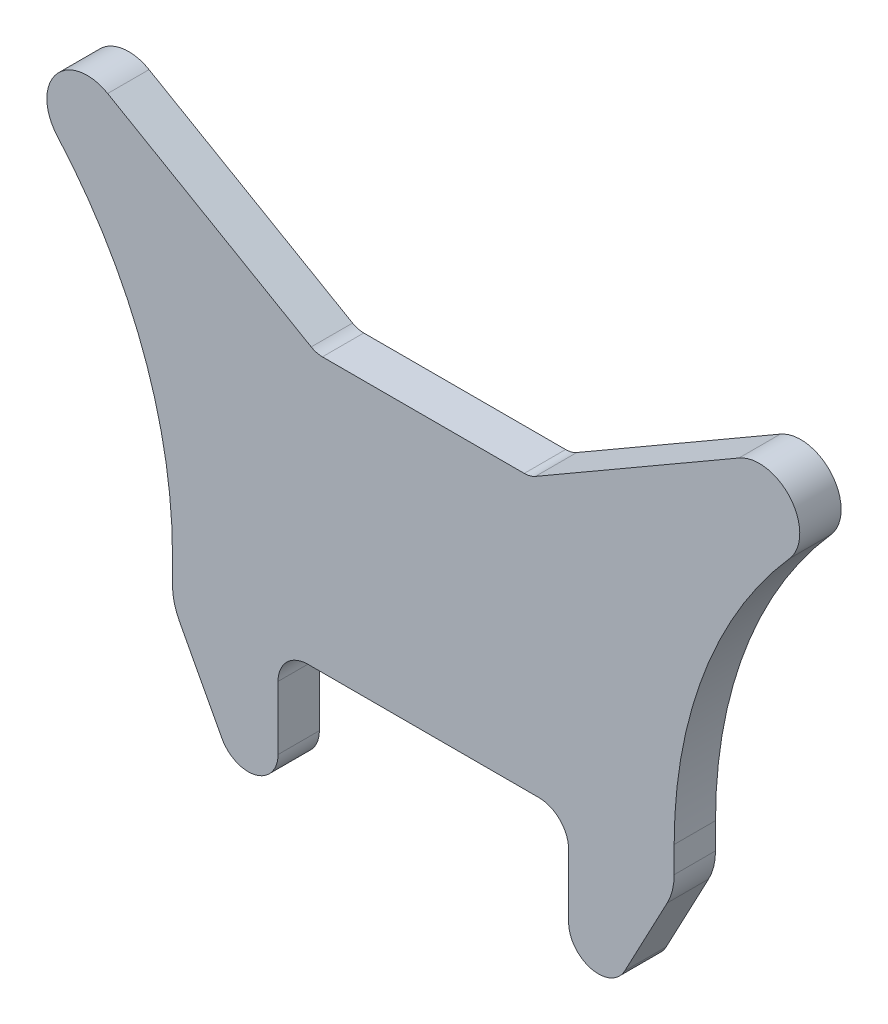
ISO-10303-21;
HEADER;
FILE_DESCRIPTION(('STEP AP214'),'2;1');
FILE_NAME('part.step','',(''),(''),'','','');
FILE_SCHEMA(('AUTOMOTIVE_DESIGN { 1 0 10303 214 1 1 1 1 }'));
ENDSEC;
DATA;
#1=APPLICATION_CONTEXT('core data for automotive mechanical design processes');
#2=APPLICATION_PROTOCOL_DEFINITION('international standard','automotive_design',2000,#1);
#3=PRODUCT_CONTEXT('',#1,'mechanical');
#4=PRODUCT('Part','Part','',(#3));
#5=PRODUCT_RELATED_PRODUCT_CATEGORY('part','',(#4));
#6=PRODUCT_DEFINITION_FORMATION('','',#4);
#7=PRODUCT_DEFINITION_CONTEXT('part definition',#1,'design');
#8=PRODUCT_DEFINITION('design','',#6,#7);
#9=PRODUCT_DEFINITION_SHAPE('','',#8);
#10=(LENGTH_UNIT() NAMED_UNIT(*) SI_UNIT(.MILLI.,.METRE.));
#11=(NAMED_UNIT(*) PLANE_ANGLE_UNIT() SI_UNIT($,.RADIAN.));
#12=(NAMED_UNIT(*) SI_UNIT($,.STERADIAN.) SOLID_ANGLE_UNIT());
#13=UNCERTAINTY_MEASURE_WITH_UNIT(LENGTH_MEASURE(1.E-05),#10,'distance_accuracy_value','');
#14=(GEOMETRIC_REPRESENTATION_CONTEXT(3) GLOBAL_UNCERTAINTY_ASSIGNED_CONTEXT((#13)) GLOBAL_UNIT_ASSIGNED_CONTEXT((#10,
#11,#12)) REPRESENTATION_CONTEXT('',''));
#15=CARTESIAN_POINT('',(0.,0.,0.));
#16=DIRECTION('',(0.,0.,1.));
#17=DIRECTION('',(1.,0.,0.));
#18=AXIS2_PLACEMENT_3D('',#15,#16,#17);
#19=CARTESIAN_POINT('',(23.5,-40.6195652173992,5.55));
#20=DIRECTION('',(0.,0.,-1.));
#21=DIRECTION('',(-1.,0.,0.));
#22=AXIS2_PLACEMENT_3D('',#19,#20,#21);
#23=CYLINDRICAL_SURFACE('',#22,4.);
#24=CARTESIAN_POINT('',(23.5,-40.6195652173992,0.));
#25=DIRECTION('',(0.,0.,1.));
#26=DIRECTION('',(1.,0.,0.));
#27=AXIS2_PLACEMENT_3D('',#24,#25,#26);
#28=CIRCLE('',#27,4.);
#29=CARTESIAN_POINT('',(19.5,-40.6195652173992,0.));
#30=VERTEX_POINT('',#29);
#31=CARTESIAN_POINT('',(27.0335689045937,-42.4941027060851,0.));
#32=VERTEX_POINT('',#31);
#33=EDGE_CURVE('E212',#30,#32,#28,.T.);
#34=ORIENTED_EDGE('',*,*,#33,.T.);
#35=DIRECTION('',(0.,0.,-1.));
#36=VECTOR('',#35,1.);
#37=CARTESIAN_POINT('',(27.0335689045937,-42.4941027060851,5.55));
#38=LINE('',#37,#36);
#39=CARTESIAN_POINT('',(27.0335689045937,-42.4941027060851,5.55));
#40=VERTEX_POINT('',#39);
#41=EDGE_CURVE('E11',#40,#32,#38,.T.);
#42=ORIENTED_EDGE('',*,*,#41,.F.);
#43=CARTESIAN_POINT('',(23.5,-40.6195652173992,5.55));
#44=DIRECTION('',(0.,0.,1.));
#45=DIRECTION('',(1.,0.,0.));
#46=AXIS2_PLACEMENT_3D('',#43,#44,#45);
#47=CIRCLE('',#46,4.);
#48=CARTESIAN_POINT('',(19.5,-40.6195652173992,5.55));
#49=VERTEX_POINT('',#48);
#50=EDGE_CURVE('E254',#49,#40,#47,.T.);
#51=ORIENTED_EDGE('',*,*,#50,.F.);
#52=DIRECTION('',(0.,0.,-1.));
#53=VECTOR('',#52,1.);
#54=CARTESIAN_POINT('',(19.5,-40.6195652173992,5.55));
#55=LINE('',#54,#53);
#56=EDGE_CURVE('E208',#49,#30,#55,.T.);
#57=ORIENTED_EDGE('',*,*,#56,.T.);
#58=EDGE_LOOP('',(#34,#42,#51,#57));
#59=FACE_BOUND('',#58,.T.);
#60=ADVANCED_FACE('F32',(#59),#23,.T.);
#61=CARTESIAN_POINT('',(27.0335689045937,-42.4941027060851,5.55));
#62=DIRECTION('',(-0.88339222614841,0.46863437217148,0.));
#63=DIRECTION('',(-0.46863437217148,-0.88339222614841,0.));
#64=AXIS2_PLACEMENT_3D('',#61,#62,#63);
#65=PLANE('',#64);
#66=DIRECTION('',(0.46863437217148,0.88339222614841,0.));
#67=VECTOR('',#66,1.);
#68=CARTESIAN_POINT('',(27.0335689045937,-42.4941027060851,0.));
#69=LINE('',#68,#67);
#70=CARTESIAN_POINT('',(32.7318830800073,-31.7525806504434,0.));
#71=VERTEX_POINT('',#70);
#72=EDGE_CURVE('E215',#32,#71,#69,.T.);
#73=ORIENTED_EDGE('',*,*,#72,.T.);
#74=DIRECTION('',(0.,0.,-1.));
#75=VECTOR('',#74,1.);
#76=CARTESIAN_POINT('',(32.7318830800073,-31.7525806504434,5.55));
#77=LINE('',#76,#75);
#78=CARTESIAN_POINT('',(32.7318830800073,-31.7525806504434,5.55));
#79=VERTEX_POINT('',#78);
#80=EDGE_CURVE('E40',#79,#71,#77,.T.);
#81=ORIENTED_EDGE('',*,*,#80,.F.);
#82=DIRECTION('',(0.46863437217148,0.88339222614841,0.));
#83=VECTOR('',#82,1.);
#84=CARTESIAN_POINT('',(27.0335689045937,-42.4941027060851,5.55));
#85=LINE('',#84,#83);
#86=EDGE_CURVE('E133',#40,#79,#85,.T.);
#87=ORIENTED_EDGE('',*,*,#86,.F.);
#88=ORIENTED_EDGE('',*,*,#41,.T.);
#89=EDGE_LOOP('',(#73,#81,#87,#88));
#90=FACE_BOUND('',#89,.T.);
#91=ADVANCED_FACE('F382',(#90),#65,.F.);
#92=CARTESIAN_POINT('',(25.6647452708201,-28.0035056730715,5.55));
#93=DIRECTION('',(0.,0.,-1.));
#94=DIRECTION('',(-1.,0.,0.));
#95=AXIS2_PLACEMENT_3D('',#92,#93,#94);
#96=CYLINDRICAL_SURFACE('',#95,8.);
#97=CARTESIAN_POINT('',(25.6647452708201,-28.0035056730715,0.));
#98=DIRECTION('',(0.,0.,1.));
#99=DIRECTION('',(-1.,0.,0.));
#100=AXIS2_PLACEMENT_3D('',#97,#98,#99);
#101=CIRCLE('',#100,8.);
#102=CARTESIAN_POINT('',(33.6647452708201,-28.0035056730715,0.));
#103=VERTEX_POINT('',#102);
#104=EDGE_CURVE('E217',#71,#103,#101,.T.);
#105=ORIENTED_EDGE('',*,*,#104,.T.);
#106=DIRECTION('',(0.,0.,-1.));
#107=VECTOR('',#106,1.);
#108=CARTESIAN_POINT('',(33.6647452708201,-28.0035056730715,5.55));
#109=LINE('',#108,#107);
#110=CARTESIAN_POINT('',(33.6647452708201,-28.0035056730715,5.55));
#111=VERTEX_POINT('',#110);
#112=EDGE_CURVE('E303',#111,#103,#109,.T.);
#113=ORIENTED_EDGE('',*,*,#112,.F.);
#114=CARTESIAN_POINT('',(25.6647452708201,-28.0035056730715,5.55));
#115=DIRECTION('',(0.,0.,1.));
#116=DIRECTION('',(-1.,0.,0.));
#117=AXIS2_PLACEMENT_3D('',#114,#115,#116);
#118=CIRCLE('',#117,8.);
#119=EDGE_CURVE('E311',#79,#111,#118,.T.);
#120=ORIENTED_EDGE('',*,*,#119,.F.);
#121=ORIENTED_EDGE('',*,*,#80,.T.);
#122=EDGE_LOOP('',(#105,#113,#120,#121));
#123=FACE_BOUND('',#122,.T.);
#124=ADVANCED_FACE('F309',(#123),#96,.T.);
#125=CARTESIAN_POINT('',(33.6647452708201,-28.0035056730715,5.55));
#126=DIRECTION('',(-1.,0.,0.));
#127=DIRECTION('',(0.,0.,1.));
#128=AXIS2_PLACEMENT_3D('',#125,#126,#127);
#129=PLANE('',#128);
#130=DIRECTION('',(0.,1.,0.));
#131=VECTOR('',#130,1.);
#132=CARTESIAN_POINT('',(33.6647452708201,-28.0035056730715,0.));
#133=LINE('',#132,#131);
#134=CARTESIAN_POINT('',(33.6647452708201,-24.4941027060851,0.));
#135=VERTEX_POINT('',#134);
#136=EDGE_CURVE('E219',#103,#135,#133,.T.);
#137=ORIENTED_EDGE('',*,*,#136,.T.);
#138=DIRECTION('',(0.,0.,-1.));
#139=VECTOR('',#138,1.);
#140=CARTESIAN_POINT('',(33.6647452708201,-24.4941027060851,5.55));
#141=LINE('',#140,#139);
#142=CARTESIAN_POINT('',(33.6647452708201,-24.4941027060851,5.55));
#143=VERTEX_POINT('',#142);
#144=EDGE_CURVE('E300',#143,#135,#141,.T.);
#145=ORIENTED_EDGE('',*,*,#144,.F.);
#146=DIRECTION('',(0.,1.,0.));
#147=VECTOR('',#146,1.);
#148=CARTESIAN_POINT('',(33.6647452708201,-28.0035056730715,5.55));
#149=LINE('',#148,#147);
#150=EDGE_CURVE('E329',#111,#143,#149,.T.);
#151=ORIENTED_EDGE('',*,*,#150,.F.);
#152=ORIENTED_EDGE('',*,*,#112,.T.);
#153=EDGE_LOOP('',(#137,#145,#151,#152));
#154=FACE_BOUND('',#153,.T.);
#155=ADVANCED_FACE('F320',(#154),#129,.F.);
#156=CARTESIAN_POINT('',(95.640551722433,-24.4941027060851,5.55));
#157=DIRECTION('',(0.,0.,-1.));
#158=DIRECTION('',(-1.,0.,0.));
#159=AXIS2_PLACEMENT_3D('',#156,#157,#158);
#160=CYLINDRICAL_SURFACE('',#159,61.9758064516129);
#161=CARTESIAN_POINT('',(95.640551722433,-24.4941027060851,0.));
#162=DIRECTION('',(0.,0.,-1.));
#163=DIRECTION('',(-1.,0.,0.));
#164=AXIS2_PLACEMENT_3D('',#161,#162,#163);
#165=CIRCLE('',#164,61.9758064516129);
#166=CARTESIAN_POINT('',(49.1647452708201,16.5058972939149,0.));
#167=VERTEX_POINT('',#166);
#168=EDGE_CURVE('E221',#135,#167,#165,.T.);
#169=ORIENTED_EDGE('',*,*,#168,.T.);
#170=DIRECTION('',(0.,0.,-1.));
#171=VECTOR('',#170,1.);
#172=CARTESIAN_POINT('',(49.1647452708201,16.5058972939149,5.55));
#173=LINE('',#172,#171);
#174=CARTESIAN_POINT('',(49.1647452708201,16.5058972939149,5.55));
#175=VERTEX_POINT('',#174);
#176=EDGE_CURVE('E297',#175,#167,#173,.T.);
#177=ORIENTED_EDGE('',*,*,#176,.F.);
#178=CARTESIAN_POINT('',(95.640551722433,-24.4941027060851,5.55));
#179=DIRECTION('',(0.,0.,-1.));
#180=DIRECTION('',(-1.,0.,0.));
#181=AXIS2_PLACEMENT_3D('',#178,#179,#180);
#182=CIRCLE('',#181,61.9758064516129);
#183=EDGE_CURVE('E326',#143,#175,#182,.T.);
#184=ORIENTED_EDGE('',*,*,#183,.F.);
#185=ORIENTED_EDGE('',*,*,#144,.T.);
#186=EDGE_LOOP('',(#169,#177,#184,#185));
#187=FACE_BOUND('',#186,.T.);
#188=ADVANCED_FACE('F324',(#187),#160,.F.);
#189=CARTESIAN_POINT('',(45.0965247112885,20.0947977493476,5.55));
#190=DIRECTION('',(0.,0.,-1.));
#191=DIRECTION('',(-1.,0.,0.));
#192=AXIS2_PLACEMENT_3D('',#189,#190,#191);
#193=CYLINDRICAL_SURFACE('',#192,5.425);
#194=CARTESIAN_POINT('',(45.0965247112885,20.0947977493476,0.));
#195=DIRECTION('',(0.,0.,1.));
#196=DIRECTION('',(1.,0.,0.));
#197=AXIS2_PLACEMENT_3D('',#194,#195,#196);
#198=CIRCLE('',#197,5.425);
#199=CARTESIAN_POINT('',(42.3624013430761,24.7804347826008,0.));
#200=VERTEX_POINT('',#199);
#201=EDGE_CURVE('E223',#167,#200,#198,.T.);
#202=ORIENTED_EDGE('',*,*,#201,.T.);
#203=DIRECTION('',(0.,0.,-1.));
#204=VECTOR('',#203,1.);
#205=CARTESIAN_POINT('',(42.3624013430761,24.7804347826008,5.55));
#206=LINE('',#205,#204);
#207=CARTESIAN_POINT('',(42.3624013430761,24.7804347826008,5.55));
#208=VERTEX_POINT('',#207);
#209=EDGE_CURVE('E294',#208,#200,#206,.T.);
#210=ORIENTED_EDGE('',*,*,#209,.F.);
#211=CARTESIAN_POINT('',(45.0965247112885,20.0947977493476,5.55));
#212=DIRECTION('',(0.,0.,1.));
#213=DIRECTION('',(1.,0.,0.));
#214=AXIS2_PLACEMENT_3D('',#211,#212,#213);
#215=CIRCLE('',#214,5.425);
#216=EDGE_CURVE('E328',#175,#208,#215,.T.);
#217=ORIENTED_EDGE('',*,*,#216,.F.);
#218=ORIENTED_EDGE('',*,*,#176,.T.);
#219=EDGE_LOOP('',(#202,#210,#217,#218));
#220=FACE_BOUND('',#219,.T.);
#221=ADVANCED_FACE('F395',(#220),#193,.T.);
#222=CARTESIAN_POINT('',(42.3624013430761,24.7804347826008,5.55));
#223=DIRECTION('',(0.5006264064338,-0.865663445676886,0.));
#224=DIRECTION('',(0.865663445676886,0.5006264064338,0.));
#225=AXIS2_PLACEMENT_3D('',#222,#223,#224);
#226=PLANE('',#225);
#227=DIRECTION('',(-0.865663445676886,-0.5006264064338,0.));
#228=VECTOR('',#227,1.);
#229=CARTESIAN_POINT('',(42.3624013430761,24.7804347826008,0.));
#230=LINE('',#229,#228);
#231=CARTESIAN_POINT('',(15.0468684212491,8.9834444455702,0.));
#232=VERTEX_POINT('',#231);
#233=EDGE_CURVE('E225',#200,#232,#230,.T.);
#234=ORIENTED_EDGE('',*,*,#233,.T.);
#235=DIRECTION('',(0.,0.,-1.));
#236=VECTOR('',#235,1.);
#237=CARTESIAN_POINT('',(15.0468684212491,8.9834444455702,5.55));
#238=LINE('',#237,#236);
#239=CARTESIAN_POINT('',(15.0468684212491,8.9834444455702,5.55));
#240=VERTEX_POINT('',#239);
#241=EDGE_CURVE('E291',#240,#232,#238,.T.);
#242=ORIENTED_EDGE('',*,*,#241,.F.);
#243=DIRECTION('',(-0.865663445676886,-0.5006264064338,0.));
#244=VECTOR('',#243,1.);
#245=CARTESIAN_POINT('',(42.3624013430761,24.7804347826008,5.55));
#246=LINE('',#245,#244);
#247=EDGE_CURVE('E331',#208,#240,#246,.T.);
#248=ORIENTED_EDGE('',*,*,#247,.F.);
#249=ORIENTED_EDGE('',*,*,#209,.T.);
#250=EDGE_LOOP('',(#234,#242,#248,#249));
#251=FACE_BOUND('',#250,.T.);
#252=ADVANCED_FACE('F398',(#251),#226,.F.);
#253=CARTESIAN_POINT('',(13.5449892019477,11.5804347826008,5.55));
#254=DIRECTION('',(0.,0.,-1.));
#255=DIRECTION('',(-1.,0.,0.));
#256=AXIS2_PLACEMENT_3D('',#253,#254,#255);
#257=CYLINDRICAL_SURFACE('',#256,2.99999999999998);
#258=CARTESIAN_POINT('',(13.5449892019477,11.5804347826008,0.));
#259=DIRECTION('',(0.,0.,-1.));
#260=DIRECTION('',(-1.,0.,0.));
#261=AXIS2_PLACEMENT_3D('',#258,#259,#260);
#262=CIRCLE('',#261,2.99999999999998);
#263=CARTESIAN_POINT('',(13.5449892019477,8.58043478260083,0.));
#264=VERTEX_POINT('',#263);
#265=EDGE_CURVE('E227',#232,#264,#262,.T.);
#266=ORIENTED_EDGE('',*,*,#265,.T.);
#267=DIRECTION('',(0.,0.,-1.));
#268=VECTOR('',#267,1.);
#269=CARTESIAN_POINT('',(13.5449892019477,8.58043478260083,5.55));
#270=LINE('',#269,#268);
#271=CARTESIAN_POINT('',(13.5449892019477,8.58043478260083,5.55));
#272=VERTEX_POINT('',#271);
#273=EDGE_CURVE('E288',#272,#264,#270,.T.);
#274=ORIENTED_EDGE('',*,*,#273,.F.);
#275=CARTESIAN_POINT('',(13.5449892019477,11.5804347826008,5.55));
#276=DIRECTION('',(0.,0.,-1.));
#277=DIRECTION('',(-1.,0.,0.));
#278=AXIS2_PLACEMENT_3D('',#275,#276,#277);
#279=CIRCLE('',#278,2.99999999999998);
#280=EDGE_CURVE('E337',#240,#272,#279,.T.);
#281=ORIENTED_EDGE('',*,*,#280,.F.);
#282=ORIENTED_EDGE('',*,*,#241,.T.);
#283=EDGE_LOOP('',(#266,#274,#281,#282));
#284=FACE_BOUND('',#283,.T.);
#285=ADVANCED_FACE('F402',(#284),#257,.F.);
#286=CARTESIAN_POINT('',(13.5449892019477,8.58043478260083,5.55));
#287=DIRECTION('',(0.,-1.,0.));
#288=DIRECTION('',(1.,0.,0.));
#289=AXIS2_PLACEMENT_3D('',#286,#287,#288);
#290=PLANE('',#289);
#291=DIRECTION('',(-1.,0.,0.));
#292=VECTOR('',#291,1.);
#293=CARTESIAN_POINT('',(13.5449892019477,8.58043478260083,0.));
#294=LINE('',#293,#292);
#295=CARTESIAN_POINT('',(-13.5449892019477,8.58043478260085,0.));
#296=VERTEX_POINT('',#295);
#297=EDGE_CURVE('E229',#264,#296,#294,.T.);
#298=ORIENTED_EDGE('',*,*,#297,.T.);
#299=DIRECTION('',(0.,0.,-1.));
#300=VECTOR('',#299,1.);
#301=CARTESIAN_POINT('',(-13.5449892019477,8.58043478260085,5.55));
#302=LINE('',#301,#300);
#303=CARTESIAN_POINT('',(-13.5449892019477,8.58043478260085,5.55));
#304=VERTEX_POINT('',#303);
#305=EDGE_CURVE('E285',#304,#296,#302,.T.);
#306=ORIENTED_EDGE('',*,*,#305,.F.);
#307=DIRECTION('',(-1.,0.,0.));
#308=VECTOR('',#307,1.);
#309=CARTESIAN_POINT('',(13.5449892019477,8.58043478260083,5.55));
#310=LINE('',#309,#308);
#311=EDGE_CURVE('E339',#272,#304,#310,.T.);
#312=ORIENTED_EDGE('',*,*,#311,.F.);
#313=ORIENTED_EDGE('',*,*,#273,.T.);
#314=EDGE_LOOP('',(#298,#306,#312,#313));
#315=FACE_BOUND('',#314,.T.);
#316=ADVANCED_FACE('F406',(#315),#290,.F.);
#317=CARTESIAN_POINT('',(-13.5449892019477,11.5804347826009,5.55));
#318=DIRECTION('',(0.,0.,-1.));
#319=DIRECTION('',(-1.,0.,0.));
#320=AXIS2_PLACEMENT_3D('',#317,#318,#319);
#321=CYLINDRICAL_SURFACE('',#320,3.);
#322=CARTESIAN_POINT('',(-13.5449892019477,11.5804347826009,0.));
#323=DIRECTION('',(0.,0.,-1.));
#324=DIRECTION('',(1.,0.,0.));
#325=AXIS2_PLACEMENT_3D('',#322,#323,#324);
#326=CIRCLE('',#325,3.);
#327=CARTESIAN_POINT('',(-15.0468684212491,8.9834444455702,0.));
#328=VERTEX_POINT('',#327);
#329=EDGE_CURVE('E231',#296,#328,#326,.T.);
#330=ORIENTED_EDGE('',*,*,#329,.T.);
#331=DIRECTION('',(0.,0.,-1.));
#332=VECTOR('',#331,1.);
#333=CARTESIAN_POINT('',(-15.0468684212491,8.9834444455702,5.55));
#334=LINE('',#333,#332);
#335=CARTESIAN_POINT('',(-15.0468684212491,8.9834444455702,5.55));
#336=VERTEX_POINT('',#335);
#337=EDGE_CURVE('E282',#336,#328,#334,.T.);
#338=ORIENTED_EDGE('',*,*,#337,.F.);
#339=CARTESIAN_POINT('',(-13.5449892019477,11.5804347826009,5.55));
#340=DIRECTION('',(0.,0.,-1.));
#341=DIRECTION('',(1.,0.,0.));
#342=AXIS2_PLACEMENT_3D('',#339,#340,#341);
#343=CIRCLE('',#342,3.);
#344=EDGE_CURVE('E341',#304,#336,#343,.T.);
#345=ORIENTED_EDGE('',*,*,#344,.F.);
#346=ORIENTED_EDGE('',*,*,#305,.T.);
#347=EDGE_LOOP('',(#330,#338,#345,#346));
#348=FACE_BOUND('',#347,.T.);
#349=ADVANCED_FACE('F410',(#348),#321,.F.);
#350=CARTESIAN_POINT('',(-42.3624013430761,24.7804347826008,5.55));
#351=DIRECTION('',(-0.500626406433801,-0.865663445676886,0.));
#352=DIRECTION('',(0.865663445676886,-0.500626406433801,0.));
#353=AXIS2_PLACEMENT_3D('',#350,#351,#352);
#354=PLANE('',#353);
#355=DIRECTION('',(-0.865663445676886,0.500626406433801,0.));
#356=VECTOR('',#355,1.);
#357=CARTESIAN_POINT('',(-42.3624013430761,24.7804347826008,0.));
#358=LINE('',#357,#356);
#359=CARTESIAN_POINT('',(-42.3624013430761,24.7804347826008,0.));
#360=VERTEX_POINT('',#359);
#361=EDGE_CURVE('E233',#328,#360,#358,.T.);
#362=ORIENTED_EDGE('',*,*,#361,.T.);
#363=DIRECTION('',(0.,0.,-1.));
#364=VECTOR('',#363,1.);
#365=CARTESIAN_POINT('',(-42.3624013430761,24.7804347826008,5.55));
#366=LINE('',#365,#364);
#367=CARTESIAN_POINT('',(-42.3624013430761,24.7804347826008,5.55));
#368=VERTEX_POINT('',#367);
#369=EDGE_CURVE('E279',#368,#360,#366,.T.);
#370=ORIENTED_EDGE('',*,*,#369,.F.);
#371=DIRECTION('',(-0.865663445676886,0.500626406433801,0.));
#372=VECTOR('',#371,1.);
#373=CARTESIAN_POINT('',(-42.3624013430761,24.7804347826008,5.55));
#374=LINE('',#373,#372);
#375=EDGE_CURVE('E343',#336,#368,#374,.T.);
#376=ORIENTED_EDGE('',*,*,#375,.F.);
#377=ORIENTED_EDGE('',*,*,#337,.T.);
#378=EDGE_LOOP('',(#362,#370,#376,#377));
#379=FACE_BOUND('',#378,.T.);
#380=ADVANCED_FACE('F414',(#379),#354,.F.);
#381=CARTESIAN_POINT('',(-45.0965247112885,20.0947977493476,5.55));
#382=DIRECTION('',(0.,0.,-1.));
#383=DIRECTION('',(-1.,0.,0.));
#384=AXIS2_PLACEMENT_3D('',#381,#382,#383);
#385=CYLINDRICAL_SURFACE('',#384,5.425);
#386=CARTESIAN_POINT('',(-45.0965247112885,20.0947977493476,0.));
#387=DIRECTION('',(0.,0.,1.));
#388=DIRECTION('',(-1.,0.,0.));
#389=AXIS2_PLACEMENT_3D('',#386,#387,#388);
#390=CIRCLE('',#389,5.425);
#391=CARTESIAN_POINT('',(-49.1647452708201,16.5058972939149,0.));
#392=VERTEX_POINT('',#391);
#393=EDGE_CURVE('E235',#360,#392,#390,.T.);
#394=ORIENTED_EDGE('',*,*,#393,.T.);
#395=DIRECTION('',(0.,0.,-1.));
#396=VECTOR('',#395,1.);
#397=CARTESIAN_POINT('',(-49.1647452708201,16.5058972939149,5.55));
#398=LINE('',#397,#396);
#399=CARTESIAN_POINT('',(-49.1647452708201,16.5058972939149,5.55));
#400=VERTEX_POINT('',#399);
#401=EDGE_CURVE('E276',#400,#392,#398,.T.);
#402=ORIENTED_EDGE('',*,*,#401,.F.);
#403=CARTESIAN_POINT('',(-45.0965247112885,20.0947977493476,5.55));
#404=DIRECTION('',(0.,0.,1.));
#405=DIRECTION('',(-1.,0.,0.));
#406=AXIS2_PLACEMENT_3D('',#403,#404,#405);
#407=CIRCLE('',#406,5.425);
#408=EDGE_CURVE('E345',#368,#400,#407,.T.);
#409=ORIENTED_EDGE('',*,*,#408,.F.);
#410=ORIENTED_EDGE('',*,*,#369,.T.);
#411=EDGE_LOOP('',(#394,#402,#409,#410));
#412=FACE_BOUND('',#411,.T.);
#413=ADVANCED_FACE('F418',(#412),#385,.T.);
#414=CARTESIAN_POINT('',(-95.640551722433,-24.494102706085,5.55));
#415=DIRECTION('',(0.,0.,-1.));
#416=DIRECTION('',(-1.,0.,0.));
#417=AXIS2_PLACEMENT_3D('',#414,#415,#416);
#418=CYLINDRICAL_SURFACE('',#417,61.9758064516129);
#419=CARTESIAN_POINT('',(-95.640551722433,-24.494102706085,0.));
#420=DIRECTION('',(0.,0.,-1.));
#421=DIRECTION('',(1.,0.,0.));
#422=AXIS2_PLACEMENT_3D('',#419,#420,#421);
#423=CIRCLE('',#422,61.9758064516129);
#424=CARTESIAN_POINT('',(-33.6647452708201,-24.494102706085,0.));
#425=VERTEX_POINT('',#424);
#426=EDGE_CURVE('E237',#392,#425,#423,.T.);
#427=ORIENTED_EDGE('',*,*,#426,.T.);
#428=DIRECTION('',(0.,0.,-1.));
#429=VECTOR('',#428,1.);
#430=CARTESIAN_POINT('',(-33.6647452708201,-24.494102706085,5.55));
#431=LINE('',#430,#429);
#432=CARTESIAN_POINT('',(-33.6647452708201,-24.494102706085,5.55));
#433=VERTEX_POINT('',#432);
#434=EDGE_CURVE('E273',#433,#425,#431,.T.);
#435=ORIENTED_EDGE('',*,*,#434,.F.);
#436=CARTESIAN_POINT('',(-95.640551722433,-24.494102706085,5.55));
#437=DIRECTION('',(0.,0.,-1.));
#438=DIRECTION('',(1.,0.,0.));
#439=AXIS2_PLACEMENT_3D('',#436,#437,#438);
#440=CIRCLE('',#439,61.9758064516129);
#441=EDGE_CURVE('E347',#400,#433,#440,.T.);
#442=ORIENTED_EDGE('',*,*,#441,.F.);
#443=ORIENTED_EDGE('',*,*,#401,.T.);
#444=EDGE_LOOP('',(#427,#435,#442,#443));
#445=FACE_BOUND('',#444,.T.);
#446=ADVANCED_FACE('F422',(#445),#418,.F.);
#447=CARTESIAN_POINT('',(-33.6647452708201,-28.0035056730715,5.55));
#448=DIRECTION('',(1.,0.,0.));
#449=DIRECTION('',(0.,0.,-1.));
#450=AXIS2_PLACEMENT_3D('',#447,#448,#449);
#451=PLANE('',#450);
#452=DIRECTION('',(0.,-1.,0.));
#453=VECTOR('',#452,1.);
#454=CARTESIAN_POINT('',(-33.6647452708201,-28.0035056730715,0.));
#455=LINE('',#454,#453);
#456=CARTESIAN_POINT('',(-33.6647452708201,-28.0035056730715,0.));
#457=VERTEX_POINT('',#456);
#458=EDGE_CURVE('E239',#425,#457,#455,.T.);
#459=ORIENTED_EDGE('',*,*,#458,.T.);
#460=DIRECTION('',(0.,0.,-1.));
#461=VECTOR('',#460,1.);
#462=CARTESIAN_POINT('',(-33.6647452708201,-28.0035056730715,5.55));
#463=LINE('',#462,#461);
#464=CARTESIAN_POINT('',(-33.6647452708201,-28.0035056730715,5.55));
#465=VERTEX_POINT('',#464);
#466=EDGE_CURVE('E270',#465,#457,#463,.T.);
#467=ORIENTED_EDGE('',*,*,#466,.F.);
#468=DIRECTION('',(0.,-1.,0.));
#469=VECTOR('',#468,1.);
#470=CARTESIAN_POINT('',(-33.6647452708201,-28.0035056730715,5.55));
#471=LINE('',#470,#469);
#472=EDGE_CURVE('E349',#433,#465,#471,.T.);
#473=ORIENTED_EDGE('',*,*,#472,.F.);
#474=ORIENTED_EDGE('',*,*,#434,.T.);
#475=EDGE_LOOP('',(#459,#467,#473,#474));
#476=FACE_BOUND('',#475,.T.);
#477=ADVANCED_FACE('F426',(#476),#451,.F.);
#478=CARTESIAN_POINT('',(-25.6647452708201,-28.0035056730715,5.55));
#479=DIRECTION('',(0.,0.,-1.));
#480=DIRECTION('',(-1.,0.,0.));
#481=AXIS2_PLACEMENT_3D('',#478,#479,#480);
#482=CYLINDRICAL_SURFACE('',#481,8.);
#483=CARTESIAN_POINT('',(-25.6647452708201,-28.0035056730715,0.));
#484=DIRECTION('',(0.,0.,1.));
#485=DIRECTION('',(1.,0.,0.));
#486=AXIS2_PLACEMENT_3D('',#483,#484,#485);
#487=CIRCLE('',#486,8.);
#488=CARTESIAN_POINT('',(-32.7318830800073,-31.7525806504434,0.));
#489=VERTEX_POINT('',#488);
#490=EDGE_CURVE('E241',#457,#489,#487,.T.);
#491=ORIENTED_EDGE('',*,*,#490,.T.);
#492=DIRECTION('',(0.,0.,-1.));
#493=VECTOR('',#492,1.);
#494=CARTESIAN_POINT('',(-32.7318830800073,-31.7525806504434,5.55));
#495=LINE('',#494,#493);
#496=CARTESIAN_POINT('',(-32.7318830800073,-31.7525806504434,5.55));
#497=VERTEX_POINT('',#496);
#498=EDGE_CURVE('E267',#497,#489,#495,.T.);
#499=ORIENTED_EDGE('',*,*,#498,.F.);
#500=CARTESIAN_POINT('',(-25.6647452708201,-28.0035056730715,5.55));
#501=DIRECTION('',(0.,0.,1.));
#502=DIRECTION('',(1.,0.,0.));
#503=AXIS2_PLACEMENT_3D('',#500,#501,#502);
#504=CIRCLE('',#503,8.);
#505=EDGE_CURVE('E351',#465,#497,#504,.T.);
#506=ORIENTED_EDGE('',*,*,#505,.F.);
#507=ORIENTED_EDGE('',*,*,#466,.T.);
#508=EDGE_LOOP('',(#491,#499,#506,#507));
#509=FACE_BOUND('',#508,.T.);
#510=ADVANCED_FACE('F430',(#509),#482,.T.);
#511=CARTESIAN_POINT('',(-27.0335689045937,-42.4941027060851,5.55));
#512=DIRECTION('',(0.88339222614841,0.46863437217148,0.));
#513=DIRECTION('',(-0.46863437217148,0.88339222614841,0.));
#514=AXIS2_PLACEMENT_3D('',#511,#512,#513);
#515=PLANE('',#514);
#516=DIRECTION('',(0.46863437217148,-0.88339222614841,0.));
#517=VECTOR('',#516,1.);
#518=CARTESIAN_POINT('',(-27.0335689045937,-42.4941027060851,0.));
#519=LINE('',#518,#517);
#520=CARTESIAN_POINT('',(-27.0335689045936,-42.4941027060851,0.));
#521=VERTEX_POINT('',#520);
#522=EDGE_CURVE('E243',#489,#521,#519,.T.);
#523=ORIENTED_EDGE('',*,*,#522,.T.);
#524=DIRECTION('',(0.,0.,-1.));
#525=VECTOR('',#524,1.);
#526=CARTESIAN_POINT('',(-27.0335689045936,-42.4941027060851,5.55));
#527=LINE('',#526,#525);
#528=CARTESIAN_POINT('',(-27.0335689045936,-42.4941027060851,5.55));
#529=VERTEX_POINT('',#528);
#530=EDGE_CURVE('E264',#529,#521,#527,.T.);
#531=ORIENTED_EDGE('',*,*,#530,.F.);
#532=DIRECTION('',(0.46863437217148,-0.88339222614841,0.));
#533=VECTOR('',#532,1.);
#534=CARTESIAN_POINT('',(-27.0335689045937,-42.4941027060851,5.55));
#535=LINE('',#534,#533);
#536=EDGE_CURVE('E353',#497,#529,#535,.T.);
#537=ORIENTED_EDGE('',*,*,#536,.F.);
#538=ORIENTED_EDGE('',*,*,#498,.T.);
#539=EDGE_LOOP('',(#523,#531,#537,#538));
#540=FACE_BOUND('',#539,.T.);
#541=ADVANCED_FACE('F434',(#540),#515,.F.);
#542=CARTESIAN_POINT('',(-23.5,-40.6195652173991,5.55));
#543=DIRECTION('',(0.,0.,-1.));
#544=DIRECTION('',(-1.,0.,0.));
#545=AXIS2_PLACEMENT_3D('',#542,#543,#544);
#546=CYLINDRICAL_SURFACE('',#545,4.);
#547=CARTESIAN_POINT('',(-23.5,-40.6195652173991,0.));
#548=DIRECTION('',(0.,0.,1.));
#549=DIRECTION('',(-1.,0.,0.));
#550=AXIS2_PLACEMENT_3D('',#547,#548,#549);
#551=CIRCLE('',#550,4.);
#552=CARTESIAN_POINT('',(-19.5,-40.6195652173991,0.));
#553=VERTEX_POINT('',#552);
#554=EDGE_CURVE('E245',#521,#553,#551,.T.);
#555=ORIENTED_EDGE('',*,*,#554,.T.);
#556=DIRECTION('',(0.,0.,-1.));
#557=VECTOR('',#556,1.);
#558=CARTESIAN_POINT('',(-19.5,-40.6195652173991,5.55));
#559=LINE('',#558,#557);
#560=CARTESIAN_POINT('',(-19.5,-40.6195652173991,5.55));
#561=VERTEX_POINT('',#560);
#562=EDGE_CURVE('E261',#561,#553,#559,.T.);
#563=ORIENTED_EDGE('',*,*,#562,.F.);
#564=CARTESIAN_POINT('',(-23.5,-40.6195652173991,5.55));
#565=DIRECTION('',(0.,0.,1.));
#566=DIRECTION('',(-1.,0.,0.));
#567=AXIS2_PLACEMENT_3D('',#564,#565,#566);
#568=CIRCLE('',#567,4.);
#569=EDGE_CURVE('E355',#529,#561,#568,.T.);
#570=ORIENTED_EDGE('',*,*,#569,.F.);
#571=ORIENTED_EDGE('',*,*,#530,.T.);
#572=EDGE_LOOP('',(#555,#563,#570,#571));
#573=FACE_BOUND('',#572,.T.);
#574=ADVANCED_FACE('F438',(#573),#546,.T.);
#575=CARTESIAN_POINT('',(-19.5,-32.1195652173991,5.55));
#576=DIRECTION('',(-1.,0.,0.));
#577=DIRECTION('',(0.,-1.,0.));
#578=AXIS2_PLACEMENT_3D('',#575,#576,#577);
#579=PLANE('',#578);
#580=DIRECTION('',(0.,1.,0.));
#581=VECTOR('',#580,1.);
#582=CARTESIAN_POINT('',(-19.5,-32.1195652173991,0.));
#583=LINE('',#582,#581);
#584=CARTESIAN_POINT('',(-19.5,-32.1195652173991,0.));
#585=VERTEX_POINT('',#584);
#586=EDGE_CURVE('E247',#553,#585,#583,.T.);
#587=ORIENTED_EDGE('',*,*,#586,.T.);
#588=DIRECTION('',(0.,0.,-1.));
#589=VECTOR('',#588,1.);
#590=CARTESIAN_POINT('',(-19.5,-32.1195652173991,5.55));
#591=LINE('',#590,#589);
#592=CARTESIAN_POINT('',(-19.5,-32.1195652173991,5.55));
#593=VERTEX_POINT('',#592);
#594=EDGE_CURVE('E258',#593,#585,#591,.T.);
#595=ORIENTED_EDGE('',*,*,#594,.F.);
#596=DIRECTION('',(0.,1.,0.));
#597=VECTOR('',#596,1.);
#598=CARTESIAN_POINT('',(-19.5,-32.1195652173991,5.55));
#599=LINE('',#598,#597);
#600=EDGE_CURVE('E357',#561,#593,#599,.T.);
#601=ORIENTED_EDGE('',*,*,#600,.F.);
#602=ORIENTED_EDGE('',*,*,#562,.T.);
#603=EDGE_LOOP('',(#587,#595,#601,#602));
#604=FACE_BOUND('',#603,.T.);
#605=ADVANCED_FACE('F363',(#604),#579,.F.);
#606=CARTESIAN_POINT('',(-15.5,-32.1195652173991,5.55));
#607=DIRECTION('',(0.,0.,-1.));
#608=DIRECTION('',(-1.,0.,0.));
#609=AXIS2_PLACEMENT_3D('',#606,#607,#608);
#610=CYLINDRICAL_SURFACE('',#609,4.);
#611=CARTESIAN_POINT('',(-15.5,-32.1195652173991,0.));
#612=DIRECTION('',(0.,0.,-1.));
#613=DIRECTION('',(-1.,0.,0.));
#614=AXIS2_PLACEMENT_3D('',#611,#612,#613);
#615=CIRCLE('',#614,4.);
#616=CARTESIAN_POINT('',(-15.5,-28.1195652173991,0.));
#617=VERTEX_POINT('',#616);
#618=EDGE_CURVE('E249',#585,#617,#615,.T.);
#619=ORIENTED_EDGE('',*,*,#618,.T.);
#620=DIRECTION('',(0.,0.,-1.));
#621=VECTOR('',#620,1.);
#622=CARTESIAN_POINT('',(-15.5,-28.1195652173991,5.55));
#623=LINE('',#622,#621);
#624=CARTESIAN_POINT('',(-15.5,-28.1195652173991,5.55));
#625=VERTEX_POINT('',#624);
#626=EDGE_CURVE('E203',#625,#617,#623,.T.);
#627=ORIENTED_EDGE('',*,*,#626,.F.);
#628=CARTESIAN_POINT('',(-15.5,-32.1195652173991,5.55));
#629=DIRECTION('',(0.,0.,-1.));
#630=DIRECTION('',(-1.,0.,0.));
#631=AXIS2_PLACEMENT_3D('',#628,#629,#630);
#632=CIRCLE('',#631,4.);
#633=EDGE_CURVE('E194',#593,#625,#632,.T.);
#634=ORIENTED_EDGE('',*,*,#633,.F.);
#635=ORIENTED_EDGE('',*,*,#594,.T.);
#636=EDGE_LOOP('',(#619,#627,#634,#635));
#637=FACE_BOUND('',#636,.T.);
#638=ADVANCED_FACE('F367',(#637),#610,.F.);
#639=CARTESIAN_POINT('',(-15.5,-28.1195652173991,5.55));
#640=DIRECTION('',(0.,1.,0.));
#641=DIRECTION('',(-1.,0.,0.));
#642=AXIS2_PLACEMENT_3D('',#639,#640,#641);
#643=PLANE('',#642);
#644=DIRECTION('',(1.,0.,0.));
#645=VECTOR('',#644,1.);
#646=CARTESIAN_POINT('',(-15.5,-28.1195652173991,0.));
#647=LINE('',#646,#645);
#648=CARTESIAN_POINT('',(15.5,-28.1195652173992,0.));
#649=VERTEX_POINT('',#648);
#650=EDGE_CURVE('E202',#617,#649,#647,.T.);
#651=ORIENTED_EDGE('',*,*,#650,.T.);
#652=DIRECTION('',(0.,0.,-1.));
#653=VECTOR('',#652,1.);
#654=CARTESIAN_POINT('',(15.5,-28.1195652173992,5.55));
#655=LINE('',#654,#653);
#656=CARTESIAN_POINT('',(15.5,-28.1195652173992,5.55));
#657=VERTEX_POINT('',#656);
#658=EDGE_CURVE('E199',#657,#649,#655,.T.);
#659=ORIENTED_EDGE('',*,*,#658,.F.);
#660=DIRECTION('',(1.,0.,0.));
#661=VECTOR('',#660,1.);
#662=CARTESIAN_POINT('',(-15.5,-28.1195652173991,5.55));
#663=LINE('',#662,#661);
#664=EDGE_CURVE('E188',#625,#657,#663,.T.);
#665=ORIENTED_EDGE('',*,*,#664,.F.);
#666=ORIENTED_EDGE('',*,*,#626,.T.);
#667=EDGE_LOOP('',(#651,#659,#665,#666));
#668=FACE_BOUND('',#667,.T.);
#669=ADVANCED_FACE('F200',(#668),#643,.F.);
#670=CARTESIAN_POINT('',(15.5,-32.1195652173992,5.55));
#671=DIRECTION('',(0.,0.,-1.));
#672=DIRECTION('',(-1.,0.,0.));
#673=AXIS2_PLACEMENT_3D('',#670,#671,#672);
#674=CYLINDRICAL_SURFACE('',#673,4.);
#675=CARTESIAN_POINT('',(15.5,-32.1195652173992,0.));
#676=DIRECTION('',(0.,0.,-1.));
#677=DIRECTION('',(1.,0.,0.));
#678=AXIS2_PLACEMENT_3D('',#675,#676,#677);
#679=CIRCLE('',#678,4.);
#680=CARTESIAN_POINT('',(19.5,-32.1195652173992,0.));
#681=VERTEX_POINT('',#680);
#682=EDGE_CURVE('E119',#649,#681,#679,.T.);
#683=ORIENTED_EDGE('',*,*,#682,.T.);
#684=DIRECTION('',(0.,0.,-1.));
#685=VECTOR('',#684,1.);
#686=CARTESIAN_POINT('',(19.5,-32.1195652173992,5.55));
#687=LINE('',#686,#685);
#688=CARTESIAN_POINT('',(19.5,-32.1195652173992,5.55));
#689=VERTEX_POINT('',#688);
#690=EDGE_CURVE('E204',#689,#681,#687,.T.);
#691=ORIENTED_EDGE('',*,*,#690,.F.);
#692=CARTESIAN_POINT('',(15.5,-32.1195652173992,5.55));
#693=DIRECTION('',(0.,0.,-1.));
#694=DIRECTION('',(1.,0.,0.));
#695=AXIS2_PLACEMENT_3D('',#692,#693,#694);
#696=CIRCLE('',#695,4.);
#697=EDGE_CURVE('E192',#657,#689,#696,.T.);
#698=ORIENTED_EDGE('',*,*,#697,.F.);
#699=ORIENTED_EDGE('',*,*,#658,.T.);
#700=EDGE_LOOP('',(#683,#691,#698,#699));
#701=FACE_BOUND('',#700,.T.);
#702=ADVANCED_FACE('F206',(#701),#674,.F.);
#703=CARTESIAN_POINT('',(19.5,-32.1195652173992,5.55));
#704=DIRECTION('',(1.,0.,0.));
#705=DIRECTION('',(0.,1.,0.));
#706=AXIS2_PLACEMENT_3D('',#703,#704,#705);
#707=PLANE('',#706);
#708=DIRECTION('',(0.,-1.,0.));
#709=VECTOR('',#708,1.);
#710=CARTESIAN_POINT('',(19.5,-32.1195652173992,0.));
#711=LINE('',#710,#709);
#712=EDGE_CURVE('E125',#681,#30,#711,.T.);
#713=ORIENTED_EDGE('',*,*,#712,.T.);
#714=ORIENTED_EDGE('',*,*,#56,.F.);
#715=DIRECTION('',(0.,-1.,0.));
#716=VECTOR('',#715,1.);
#717=CARTESIAN_POINT('',(19.5,-32.1195652173992,5.55));
#718=LINE('',#717,#716);
#719=EDGE_CURVE('E48',#689,#49,#718,.T.);
#720=ORIENTED_EDGE('',*,*,#719,.F.);
#721=ORIENTED_EDGE('',*,*,#690,.T.);
#722=EDGE_LOOP('',(#713,#714,#720,#721));
#723=FACE_BOUND('',#722,.T.);
#724=ADVANCED_FACE('F371',(#723),#707,.F.);
#725=CARTESIAN_POINT('',(23.5,-40.6195652173992,5.55));
#726=DIRECTION('',(0.,0.,1.));
#727=DIRECTION('',(1.,0.,0.));
#728=AXIS2_PLACEMENT_3D('',#725,#726,#727);
#729=PLANE('',#728);
#730=ORIENTED_EDGE('',*,*,#50,.T.);
#731=ORIENTED_EDGE('',*,*,#86,.T.);
#732=ORIENTED_EDGE('',*,*,#119,.T.);
#733=ORIENTED_EDGE('',*,*,#150,.T.);
#734=ORIENTED_EDGE('',*,*,#183,.T.);
#735=ORIENTED_EDGE('',*,*,#216,.T.);
#736=ORIENTED_EDGE('',*,*,#247,.T.);
#737=ORIENTED_EDGE('',*,*,#280,.T.);
#738=ORIENTED_EDGE('',*,*,#311,.T.);
#739=ORIENTED_EDGE('',*,*,#344,.T.);
#740=ORIENTED_EDGE('',*,*,#375,.T.);
#741=ORIENTED_EDGE('',*,*,#408,.T.);
#742=ORIENTED_EDGE('',*,*,#441,.T.);
#743=ORIENTED_EDGE('',*,*,#472,.T.);
#744=ORIENTED_EDGE('',*,*,#505,.T.);
#745=ORIENTED_EDGE('',*,*,#536,.T.);
#746=ORIENTED_EDGE('',*,*,#569,.T.);
#747=ORIENTED_EDGE('',*,*,#600,.T.);
#748=ORIENTED_EDGE('',*,*,#633,.T.);
#749=ORIENTED_EDGE('',*,*,#664,.T.);
#750=ORIENTED_EDGE('',*,*,#697,.T.);
#751=ORIENTED_EDGE('',*,*,#719,.T.);
#752=EDGE_LOOP('',(#730,#731,#732,#733,#734,#735,#736,#737,#738,#739,#740,#741,#742,#743,#744,
#745,#746,#747,#748,#749,#750,#751));
#753=FACE_BOUND('',#752,.T.);
#754=ADVANCED_FACE('F190',(#753),#729,.T.);
#755=CARTESIAN_POINT('',(23.5,-40.6195652173992,0.));
#756=DIRECTION('',(0.,0.,1.));
#757=DIRECTION('',(1.,0.,0.));
#758=AXIS2_PLACEMENT_3D('',#755,#756,#757);
#759=PLANE('',#758);
#760=ORIENTED_EDGE('',*,*,#33,.F.);
#761=ORIENTED_EDGE('',*,*,#712,.F.);
#762=ORIENTED_EDGE('',*,*,#682,.F.);
#763=ORIENTED_EDGE('',*,*,#650,.F.);
#764=ORIENTED_EDGE('',*,*,#618,.F.);
#765=ORIENTED_EDGE('',*,*,#586,.F.);
#766=ORIENTED_EDGE('',*,*,#554,.F.);
#767=ORIENTED_EDGE('',*,*,#522,.F.);
#768=ORIENTED_EDGE('',*,*,#490,.F.);
#769=ORIENTED_EDGE('',*,*,#458,.F.);
#770=ORIENTED_EDGE('',*,*,#426,.F.);
#771=ORIENTED_EDGE('',*,*,#393,.F.);
#772=ORIENTED_EDGE('',*,*,#361,.F.);
#773=ORIENTED_EDGE('',*,*,#329,.F.);
#774=ORIENTED_EDGE('',*,*,#297,.F.);
#775=ORIENTED_EDGE('',*,*,#265,.F.);
#776=ORIENTED_EDGE('',*,*,#233,.F.);
#777=ORIENTED_EDGE('',*,*,#201,.F.);
#778=ORIENTED_EDGE('',*,*,#168,.F.);
#779=ORIENTED_EDGE('',*,*,#136,.F.);
#780=ORIENTED_EDGE('',*,*,#104,.F.);
#781=ORIENTED_EDGE('',*,*,#72,.F.);
#782=EDGE_LOOP('',(#760,#761,#762,#763,#764,#765,#766,#767,#768,#769,#770,#771,#772,#773,#774,
#775,#776,#777,#778,#779,#780,#781));
#783=FACE_BOUND('',#782,.T.);
#784=ADVANCED_FACE('F315',(#783),#759,.F.);
#785=CLOSED_SHELL('',(#60,#91,#124,#155,#188,#221,#252,#285,#316,#349,#380,#413,#446,#477,#510,
#541,#574,#605,#638,#669,#702,#724,#754,#784));
#786=MANIFOLD_SOLID_BREP('B2',#785);
#787=ADVANCED_BREP_SHAPE_REPRESENTATION('',(#18,#786),#14);
#788=SHAPE_DEFINITION_REPRESENTATION(#9,#787);
ENDSEC;
END-ISO-10303-21;
